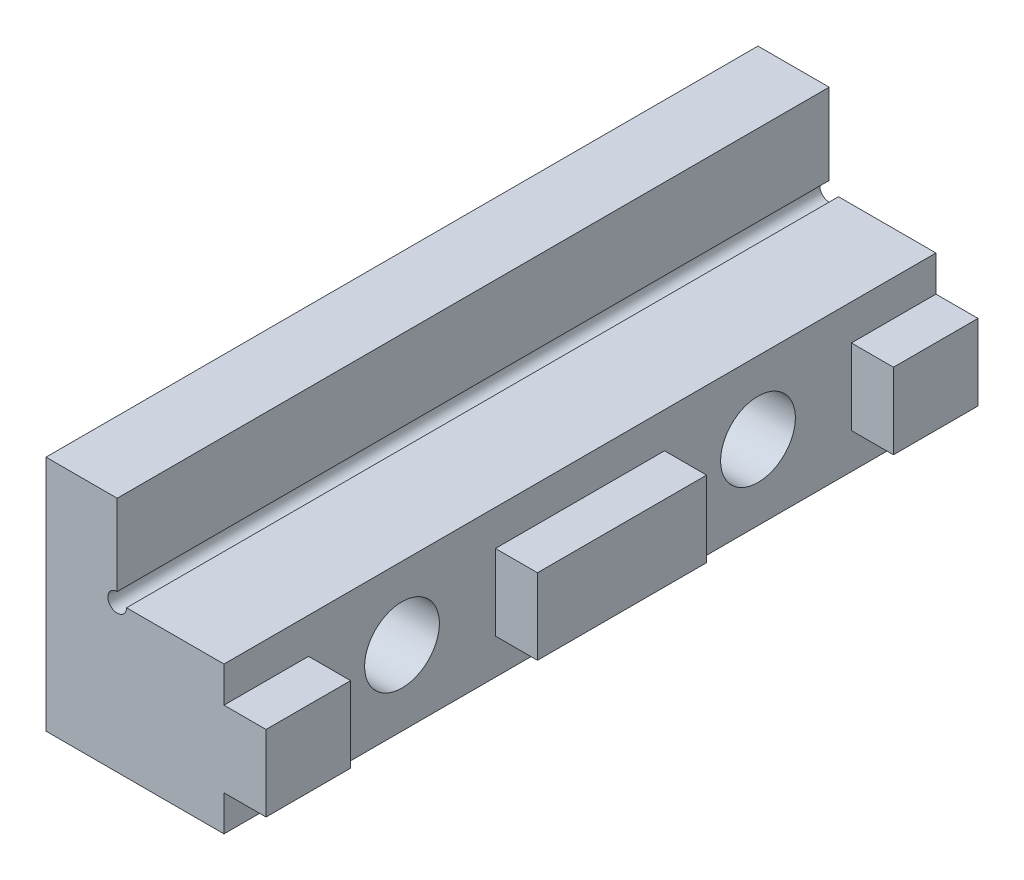
ISO-10303-21;
HEADER;
FILE_DESCRIPTION(('STEP AP214'),'2;1');
FILE_NAME('part.step','',(''),(''),'','','');
FILE_SCHEMA(('AUTOMOTIVE_DESIGN { 1 0 10303 214 1 1 1 1 }'));
ENDSEC;
DATA;
#1=APPLICATION_CONTEXT('core data for automotive mechanical design processes');
#2=APPLICATION_PROTOCOL_DEFINITION('international standard','automotive_design',2000,#1);
#3=PRODUCT_CONTEXT('',#1,'mechanical');
#4=PRODUCT('Part','Part','',(#3));
#5=PRODUCT_RELATED_PRODUCT_CATEGORY('part','',(#4));
#6=PRODUCT_DEFINITION_FORMATION('','',#4);
#7=PRODUCT_DEFINITION_CONTEXT('part definition',#1,'design');
#8=PRODUCT_DEFINITION('design','',#6,#7);
#9=PRODUCT_DEFINITION_SHAPE('','',#8);
#10=(LENGTH_UNIT() NAMED_UNIT(*) SI_UNIT(.MILLI.,.METRE.));
#11=(NAMED_UNIT(*) PLANE_ANGLE_UNIT() SI_UNIT($,.RADIAN.));
#12=(NAMED_UNIT(*) SI_UNIT($,.STERADIAN.) SOLID_ANGLE_UNIT());
#13=UNCERTAINTY_MEASURE_WITH_UNIT(LENGTH_MEASURE(1.E-05),#10,'distance_accuracy_value','');
#14=(GEOMETRIC_REPRESENTATION_CONTEXT(3) GLOBAL_UNCERTAINTY_ASSIGNED_CONTEXT((#13)) GLOBAL_UNIT_ASSIGNED_CONTEXT((#10,
#11,#12)) REPRESENTATION_CONTEXT('',''));
#15=CARTESIAN_POINT('',(0.,0.,0.));
#16=DIRECTION('',(0.,0.,1.));
#17=DIRECTION('',(1.,0.,0.));
#18=AXIS2_PLACEMENT_3D('',#15,#16,#17);
#19=CARTESIAN_POINT('',(0.,3.814,38.1));
#20=DIRECTION('',(0.,-1.,0.));
#21=DIRECTION('',(0.,0.,-1.));
#22=AXIS2_PLACEMENT_3D('',#19,#20,#21);
#23=PLANE('',#22);
#24=DIRECTION('',(-1.,0.,0.));
#25=VECTOR('',#24,1.);
#26=CARTESIAN_POINT('',(0.,3.814,29.05));
#27=LINE('',#26,#25);
#28=CARTESIAN_POINT('',(23.55,3.814,29.05));
#29=VERTEX_POINT('',#28);
#30=CARTESIAN_POINT('',(19.05,3.814,29.05));
#31=VERTEX_POINT('',#30);
#32=EDGE_CURVE('E345',#29,#31,#27,.T.);
#33=ORIENTED_EDGE('',*,*,#32,.F.);
#34=DIRECTION('',(0.,0.,-1.));
#35=VECTOR('',#34,1.);
#36=CARTESIAN_POINT('',(23.55,3.814,38.1));
#37=LINE('',#36,#35);
#38=CARTESIAN_POINT('',(23.55,3.814,38.1));
#39=VERTEX_POINT('',#38);
#40=EDGE_CURVE('E216',#39,#29,#37,.T.);
#41=ORIENTED_EDGE('',*,*,#40,.F.);
#42=DIRECTION('',(-1.,0.,0.));
#43=VECTOR('',#42,1.);
#44=CARTESIAN_POINT('',(0.,3.814,38.1));
#45=LINE('',#44,#43);
#46=CARTESIAN_POINT('',(19.05,3.814,38.1));
#47=VERTEX_POINT('',#46);
#48=EDGE_CURVE('E316',#39,#47,#45,.T.);
#49=ORIENTED_EDGE('',*,*,#48,.T.);
#50=DIRECTION('',(0.,0.,-1.));
#51=VECTOR('',#50,1.);
#52=CARTESIAN_POINT('',(19.05,3.814,38.1));
#53=LINE('',#52,#51);
#54=EDGE_CURVE('E228',#47,#31,#53,.T.);
#55=ORIENTED_EDGE('',*,*,#54,.T.);
#56=EDGE_LOOP('',(#33,#41,#49,#55));
#57=FACE_BOUND('',#56,.T.);
#58=ADVANCED_FACE('F37',(#57),#23,.T.);
#59=DIRECTION('',(1.,0.,0.));
#60=VECTOR('',#59,1.);
#61=CARTESIAN_POINT('',(0.,3.814,9.05));
#62=LINE('',#61,#60);
#63=CARTESIAN_POINT('',(19.05,3.814,9.05));
#64=VERTEX_POINT('',#63);
#65=CARTESIAN_POINT('',(23.55,3.814,9.05));
#66=VERTEX_POINT('',#65);
#67=EDGE_CURVE('E351',#64,#66,#62,.T.);
#68=ORIENTED_EDGE('',*,*,#67,.F.);
#69=CARTESIAN_POINT('',(19.05,3.814,-9.05));
#70=VERTEX_POINT('',#69);
#71=EDGE_CURVE('E227',#64,#70,#53,.T.);
#72=ORIENTED_EDGE('',*,*,#71,.T.);
#73=DIRECTION('',(-1.,0.,0.));
#74=VECTOR('',#73,1.);
#75=CARTESIAN_POINT('',(0.,3.814,-9.05));
#76=LINE('',#75,#74);
#77=CARTESIAN_POINT('',(23.55,3.814,-9.05));
#78=VERTEX_POINT('',#77);
#79=EDGE_CURVE('E357',#78,#70,#76,.T.);
#80=ORIENTED_EDGE('',*,*,#79,.F.);
#81=EDGE_CURVE('E215',#66,#78,#37,.T.);
#82=ORIENTED_EDGE('',*,*,#81,.F.);
#83=EDGE_LOOP('',(#68,#72,#80,#82));
#84=FACE_BOUND('',#83,.T.);
#85=ADVANCED_FACE('F376',(#84),#23,.T.);
#86=CARTESIAN_POINT('',(23.55,0.,38.1));
#87=DIRECTION('',(1.,0.,0.));
#88=DIRECTION('',(0.,0.,-1.));
#89=AXIS2_PLACEMENT_3D('',#86,#87,#88);
#90=PLANE('',#89);
#91=DIRECTION('',(0.,-1.,0.));
#92=VECTOR('',#91,1.);
#93=CARTESIAN_POINT('',(23.55,0.,29.05));
#94=LINE('',#93,#92);
#95=CARTESIAN_POINT('',(23.55,11.934,29.05));
#96=VERTEX_POINT('',#95);
#97=EDGE_CURVE('E346',#96,#29,#94,.T.);
#98=ORIENTED_EDGE('',*,*,#97,.F.);
#99=DIRECTION('',(0.,0.,-1.));
#100=VECTOR('',#99,1.);
#101=CARTESIAN_POINT('',(23.55,11.934,38.1));
#102=LINE('',#101,#100);
#103=CARTESIAN_POINT('',(23.55,11.934,38.1));
#104=VERTEX_POINT('',#103);
#105=EDGE_CURVE('E207',#104,#96,#102,.T.);
#106=ORIENTED_EDGE('',*,*,#105,.F.);
#107=DIRECTION('',(0.,-1.,0.));
#108=VECTOR('',#107,1.);
#109=CARTESIAN_POINT('',(23.55,0.,38.1));
#110=LINE('',#109,#108);
#111=EDGE_CURVE('E319',#104,#39,#110,.T.);
#112=ORIENTED_EDGE('',*,*,#111,.T.);
#113=ORIENTED_EDGE('',*,*,#40,.T.);
#114=EDGE_LOOP('',(#98,#106,#112,#113));
#115=FACE_BOUND('',#114,.T.);
#116=ADVANCED_FACE('F390',(#115),#90,.T.);
#117=DIRECTION('',(0.,1.,0.));
#118=VECTOR('',#117,1.);
#119=CARTESIAN_POINT('',(23.55,0.,9.05));
#120=LINE('',#119,#118);
#121=CARTESIAN_POINT('',(23.55,11.934,9.05));
#122=VERTEX_POINT('',#121);
#123=EDGE_CURVE('E353',#66,#122,#120,.T.);
#124=ORIENTED_EDGE('',*,*,#123,.F.);
#125=ORIENTED_EDGE('',*,*,#81,.T.);
#126=DIRECTION('',(0.,-1.,0.));
#127=VECTOR('',#126,1.);
#128=CARTESIAN_POINT('',(23.55,0.,-9.05));
#129=LINE('',#128,#127);
#130=CARTESIAN_POINT('',(23.55,11.934,-9.04999999999999));
#131=VERTEX_POINT('',#130);
#132=EDGE_CURVE('E181',#131,#78,#129,.T.);
#133=ORIENTED_EDGE('',*,*,#132,.F.);
#134=EDGE_CURVE('E206',#122,#131,#102,.T.);
#135=ORIENTED_EDGE('',*,*,#134,.F.);
#136=EDGE_LOOP('',(#124,#125,#133,#135));
#137=FACE_BOUND('',#136,.T.);
#138=ADVANCED_FACE('F388',(#137),#90,.T.);
#139=CARTESIAN_POINT('',(0.,11.934,38.1));
#140=DIRECTION('',(0.,1.,0.));
#141=DIRECTION('',(0.,0.,1.));
#142=AXIS2_PLACEMENT_3D('',#139,#140,#141);
#143=PLANE('',#142);
#144=DIRECTION('',(-1.,0.,0.));
#145=VECTOR('',#144,1.);
#146=CARTESIAN_POINT('',(0.,11.934,-29.05));
#147=LINE('',#146,#145);
#148=CARTESIAN_POINT('',(23.55,11.934,-29.05));
#149=VERTEX_POINT('',#148);
#150=CARTESIAN_POINT('',(19.05,11.934,-29.05));
#151=VERTEX_POINT('',#150);
#152=EDGE_CURVE('E171',#149,#151,#147,.T.);
#153=ORIENTED_EDGE('',*,*,#152,.F.);
#154=CARTESIAN_POINT('',(23.55,11.934,-38.1));
#155=VERTEX_POINT('',#154);
#156=EDGE_CURVE('E204',#149,#155,#102,.T.);
#157=ORIENTED_EDGE('',*,*,#156,.T.);
#158=DIRECTION('',(1.,0.,0.));
#159=VECTOR('',#158,1.);
#160=CARTESIAN_POINT('',(0.,11.934,-38.1));
#161=LINE('',#160,#159);
#162=CARTESIAN_POINT('',(19.05,11.934,-38.1));
#163=VERTEX_POINT('',#162);
#164=EDGE_CURVE('E196',#163,#155,#161,.T.);
#165=ORIENTED_EDGE('',*,*,#164,.F.);
#166=DIRECTION('',(0.,0.,-1.));
#167=VECTOR('',#166,1.);
#168=CARTESIAN_POINT('',(19.05,11.934,38.1));
#169=LINE('',#168,#167);
#170=EDGE_CURVE('E187',#151,#163,#169,.T.);
#171=ORIENTED_EDGE('',*,*,#170,.F.);
#172=EDGE_LOOP('',(#153,#157,#165,#171));
#173=FACE_BOUND('',#172,.T.);
#174=ADVANCED_FACE('F194',(#173),#143,.T.);
#175=DIRECTION('',(-1.,0.,0.));
#176=VECTOR('',#175,1.);
#177=CARTESIAN_POINT('',(0.,11.934,9.05));
#178=LINE('',#177,#176);
#179=CARTESIAN_POINT('',(19.05,11.934,9.05));
#180=VERTEX_POINT('',#179);
#181=EDGE_CURVE('E347',#122,#180,#178,.T.);
#182=ORIENTED_EDGE('',*,*,#181,.F.);
#183=ORIENTED_EDGE('',*,*,#134,.T.);
#184=DIRECTION('',(1.,0.,0.));
#185=VECTOR('',#184,1.);
#186=CARTESIAN_POINT('',(0.,11.934,-9.05));
#187=LINE('',#186,#185);
#188=CARTESIAN_POINT('',(19.05,11.934,-9.04999999999999));
#189=VERTEX_POINT('',#188);
#190=EDGE_CURVE('E355',#189,#131,#187,.T.);
#191=ORIENTED_EDGE('',*,*,#190,.F.);
#192=EDGE_CURVE('E197',#180,#189,#169,.T.);
#193=ORIENTED_EDGE('',*,*,#192,.F.);
#194=EDGE_LOOP('',(#182,#183,#191,#193));
#195=FACE_BOUND('',#194,.T.);
#196=ADVANCED_FACE('F385',(#195),#143,.T.);
#197=DIRECTION('',(1.,0.,0.));
#198=VECTOR('',#197,1.);
#199=CARTESIAN_POINT('',(0.,11.934,29.05));
#200=LINE('',#199,#198);
#201=CARTESIAN_POINT('',(19.05,11.934,29.05));
#202=VERTEX_POINT('',#201);
#203=EDGE_CURVE('E267',#202,#96,#200,.T.);
#204=ORIENTED_EDGE('',*,*,#203,.F.);
#205=CARTESIAN_POINT('',(19.05,11.934,38.1));
#206=VERTEX_POINT('',#205);
#207=EDGE_CURVE('E199',#206,#202,#169,.T.);
#208=ORIENTED_EDGE('',*,*,#207,.F.);
#209=DIRECTION('',(1.,0.,0.));
#210=VECTOR('',#209,1.);
#211=CARTESIAN_POINT('',(0.,11.934,38.1));
#212=LINE('',#211,#210);
#213=EDGE_CURVE('E321',#206,#104,#212,.T.);
#214=ORIENTED_EDGE('',*,*,#213,.T.);
#215=ORIENTED_EDGE('',*,*,#105,.T.);
#216=EDGE_LOOP('',(#204,#208,#214,#215));
#217=FACE_BOUND('',#216,.T.);
#218=ADVANCED_FACE('F343',(#217),#143,.T.);
#219=CARTESIAN_POINT('',(7.62,15.748,38.1));
#220=DIRECTION('',(0.,0.,-1.));
#221=DIRECTION('',(-1.,0.,0.));
#222=AXIS2_PLACEMENT_3D('',#219,#220,#221);
#223=CYLINDRICAL_SURFACE('',#222,1.);
#224=DIRECTION('',(0.,0.,-1.));
#225=VECTOR('',#224,1.);
#226=CARTESIAN_POINT('',(8.62,15.748,38.1));
#227=LINE('',#226,#225);
#228=CARTESIAN_POINT('',(8.62,15.748,38.1));
#229=VERTEX_POINT('',#228);
#230=CARTESIAN_POINT('',(8.62,15.748,-38.1));
#231=VERTEX_POINT('',#230);
#232=EDGE_CURVE('E54',#229,#231,#227,.T.);
#233=ORIENTED_EDGE('',*,*,#232,.T.);
#234=CARTESIAN_POINT('',(7.62,15.748,-38.1));
#235=DIRECTION('',(0.,0.,1.));
#236=DIRECTION('',(1.,0.,0.));
#237=AXIS2_PLACEMENT_3D('',#234,#235,#236);
#238=CIRCLE('',#237,1.);
#239=CARTESIAN_POINT('',(7.62,16.748,-38.1));
#240=VERTEX_POINT('',#239);
#241=EDGE_CURVE('E257',#240,#231,#238,.T.);
#242=ORIENTED_EDGE('',*,*,#241,.F.);
#243=DIRECTION('',(0.,0.,-1.));
#244=VECTOR('',#243,1.);
#245=CARTESIAN_POINT('',(7.62,16.748,38.1));
#246=LINE('',#245,#244);
#247=CARTESIAN_POINT('',(7.62,16.748,38.1));
#248=VERTEX_POINT('',#247);
#249=EDGE_CURVE('E248',#248,#240,#246,.T.);
#250=ORIENTED_EDGE('',*,*,#249,.F.);
#251=CARTESIAN_POINT('',(7.62,15.748,38.1));
#252=DIRECTION('',(0.,0.,1.));
#253=DIRECTION('',(1.,0.,0.));
#254=AXIS2_PLACEMENT_3D('',#251,#252,#253);
#255=CIRCLE('',#254,1.);
#256=EDGE_CURVE('E300',#248,#229,#255,.T.);
#257=ORIENTED_EDGE('',*,*,#256,.T.);
#258=EDGE_LOOP('',(#233,#242,#250,#257));
#259=FACE_BOUND('',#258,.T.);
#260=ADVANCED_FACE('F39',(#259),#223,.F.);
#261=CARTESIAN_POINT('',(7.62,0.,38.1));
#262=DIRECTION('',(1.,0.,0.));
#263=DIRECTION('',(0.,1.,0.));
#264=AXIS2_PLACEMENT_3D('',#261,#262,#263);
#265=PLANE('',#264);
#266=ORIENTED_EDGE('',*,*,#249,.T.);
#267=DIRECTION('',(0.,-1.,0.));
#268=VECTOR('',#267,1.);
#269=CARTESIAN_POINT('',(7.62,0.,-38.1));
#270=LINE('',#269,#268);
#271=CARTESIAN_POINT('',(7.62,25.4,-38.1));
#272=VERTEX_POINT('',#271);
#273=EDGE_CURVE('E277',#272,#240,#270,.T.);
#274=ORIENTED_EDGE('',*,*,#273,.F.);
#275=DIRECTION('',(0.,0.,-1.));
#276=VECTOR('',#275,1.);
#277=CARTESIAN_POINT('',(7.62,25.4,38.1));
#278=LINE('',#277,#276);
#279=CARTESIAN_POINT('',(7.62,25.4,38.1));
#280=VERTEX_POINT('',#279);
#281=EDGE_CURVE('E246',#280,#272,#278,.T.);
#282=ORIENTED_EDGE('',*,*,#281,.F.);
#283=DIRECTION('',(0.,-1.,0.));
#284=VECTOR('',#283,1.);
#285=CARTESIAN_POINT('',(7.62,0.,38.1));
#286=LINE('',#285,#284);
#287=EDGE_CURVE('E302',#280,#248,#286,.T.);
#288=ORIENTED_EDGE('',*,*,#287,.T.);
#289=EDGE_LOOP('',(#266,#274,#282,#288));
#290=FACE_BOUND('',#289,.T.);
#291=ADVANCED_FACE('F335',(#290),#265,.T.);
#292=CARTESIAN_POINT('',(0.,25.4,38.1));
#293=DIRECTION('',(0.,1.,0.));
#294=DIRECTION('',(0.,0.,1.));
#295=AXIS2_PLACEMENT_3D('',#292,#293,#294);
#296=PLANE('',#295);
#297=ORIENTED_EDGE('',*,*,#281,.T.);
#298=DIRECTION('',(1.,0.,0.));
#299=VECTOR('',#298,1.);
#300=CARTESIAN_POINT('',(0.,25.4,-38.1));
#301=LINE('',#300,#299);
#302=CARTESIAN_POINT('',(0.,25.4,-38.1));
#303=VERTEX_POINT('',#302);
#304=EDGE_CURVE('E280',#303,#272,#301,.T.);
#305=ORIENTED_EDGE('',*,*,#304,.F.);
#306=DIRECTION('',(0.,0.,-1.));
#307=VECTOR('',#306,1.);
#308=CARTESIAN_POINT('',(0.,25.4,38.1));
#309=LINE('',#308,#307);
#310=CARTESIAN_POINT('',(0.,25.4,38.1));
#311=VERTEX_POINT('',#310);
#312=EDGE_CURVE('E242',#311,#303,#309,.T.);
#313=ORIENTED_EDGE('',*,*,#312,.F.);
#314=DIRECTION('',(1.,0.,0.));
#315=VECTOR('',#314,1.);
#316=CARTESIAN_POINT('',(0.,25.4,38.1));
#317=LINE('',#316,#315);
#318=EDGE_CURVE('E305',#311,#280,#317,.T.);
#319=ORIENTED_EDGE('',*,*,#318,.T.);
#320=EDGE_LOOP('',(#297,#305,#313,#319));
#321=FACE_BOUND('',#320,.T.);
#322=ADVANCED_FACE('F420',(#321),#296,.T.);
#323=CARTESIAN_POINT('',(0.,0.,38.1));
#324=DIRECTION('',(-1.,0.,0.));
#325=DIRECTION('',(0.,0.,1.));
#326=AXIS2_PLACEMENT_3D('',#323,#324,#325);
#327=PLANE('',#326);
#328=CARTESIAN_POINT('',(0.,8.,19.05));
#329=DIRECTION('',(1.,0.,0.));
#330=DIRECTION('',(0.,0.,-1.));
#331=AXIS2_PLACEMENT_3D('',#328,#329,#330);
#332=CIRCLE('',#331,6.5);
#333=CARTESIAN_POINT('',(0.,8.,12.55));
#334=VERTEX_POINT('',#333);
#335=EDGE_CURVE('E259',#334,#334,#332,.T.);
#336=ORIENTED_EDGE('',*,*,#335,.T.);
#337=EDGE_LOOP('',(#336));
#338=FACE_BOUND('',#337,.T.);
#339=CARTESIAN_POINT('',(0.,8.,-19.05));
#340=DIRECTION('',(1.,0.,0.));
#341=DIRECTION('',(0.,0.,-1.));
#342=AXIS2_PLACEMENT_3D('',#339,#340,#341);
#343=CIRCLE('',#342,6.5);
#344=CARTESIAN_POINT('',(0.,8.,-25.55));
#345=VERTEX_POINT('',#344);
#346=EDGE_CURVE('E272',#345,#345,#343,.T.);
#347=ORIENTED_EDGE('',*,*,#346,.T.);
#348=EDGE_LOOP('',(#347));
#349=FACE_BOUND('',#348,.T.);
#350=ORIENTED_EDGE('',*,*,#312,.T.);
#351=DIRECTION('',(0.,1.,0.));
#352=VECTOR('',#351,1.);
#353=CARTESIAN_POINT('',(0.,0.,-38.1));
#354=LINE('',#353,#352);
#355=CARTESIAN_POINT('',(0.,0.,-38.1));
#356=VERTEX_POINT('',#355);
#357=EDGE_CURVE('E283',#356,#303,#354,.T.);
#358=ORIENTED_EDGE('',*,*,#357,.F.);
#359=DIRECTION('',(0.,0.,-1.));
#360=VECTOR('',#359,1.);
#361=CARTESIAN_POINT('',(0.,0.,38.1));
#362=LINE('',#361,#360);
#363=CARTESIAN_POINT('',(0.,0.,38.1));
#364=VERTEX_POINT('',#363);
#365=EDGE_CURVE('E239',#364,#356,#362,.T.);
#366=ORIENTED_EDGE('',*,*,#365,.F.);
#367=DIRECTION('',(0.,1.,0.));
#368=VECTOR('',#367,1.);
#369=CARTESIAN_POINT('',(0.,0.,38.1));
#370=LINE('',#369,#368);
#371=EDGE_CURVE('E308',#364,#311,#370,.T.);
#372=ORIENTED_EDGE('',*,*,#371,.T.);
#373=EDGE_LOOP('',(#350,#358,#366,#372));
#374=FACE_BOUND('',#373,.T.);
#375=ADVANCED_FACE('F411',(#338,#349,#374),#327,.T.);
#376=CARTESIAN_POINT('',(0.,0.,38.1));
#377=DIRECTION('',(0.,-1.,0.));
#378=DIRECTION('',(0.,0.,-1.));
#379=AXIS2_PLACEMENT_3D('',#376,#377,#378);
#380=PLANE('',#379);
#381=ORIENTED_EDGE('',*,*,#365,.T.);
#382=DIRECTION('',(-1.,0.,0.));
#383=VECTOR('',#382,1.);
#384=CARTESIAN_POINT('',(0.,0.,-38.1));
#385=LINE('',#384,#383);
#386=CARTESIAN_POINT('',(19.05,0.,-38.1));
#387=VERTEX_POINT('',#386);
#388=EDGE_CURVE('E286',#387,#356,#385,.T.);
#389=ORIENTED_EDGE('',*,*,#388,.F.);
#390=DIRECTION('',(0.,0.,-1.));
#391=VECTOR('',#390,1.);
#392=CARTESIAN_POINT('',(19.05,0.,38.1));
#393=LINE('',#392,#391);
#394=CARTESIAN_POINT('',(19.05,0.,38.1));
#395=VERTEX_POINT('',#394);
#396=EDGE_CURVE('E235',#395,#387,#393,.T.);
#397=ORIENTED_EDGE('',*,*,#396,.F.);
#398=DIRECTION('',(-1.,0.,0.));
#399=VECTOR('',#398,1.);
#400=CARTESIAN_POINT('',(0.,0.,38.1));
#401=LINE('',#400,#399);
#402=EDGE_CURVE('E311',#395,#364,#401,.T.);
#403=ORIENTED_EDGE('',*,*,#402,.T.);
#404=EDGE_LOOP('',(#381,#389,#397,#403));
#405=FACE_BOUND('',#404,.T.);
#406=ADVANCED_FACE('F407',(#405),#380,.T.);
#407=DIRECTION('',(1.,0.,0.));
#408=VECTOR('',#407,1.);
#409=CARTESIAN_POINT('',(0.,3.814,-29.05));
#410=LINE('',#409,#408);
#411=CARTESIAN_POINT('',(19.05,3.814,-29.05));
#412=VERTEX_POINT('',#411);
#413=CARTESIAN_POINT('',(23.55,3.814,-29.05));
#414=VERTEX_POINT('',#413);
#415=EDGE_CURVE('E182',#412,#414,#410,.T.);
#416=ORIENTED_EDGE('',*,*,#415,.F.);
#417=CARTESIAN_POINT('',(19.05,3.814,-38.1));
#418=VERTEX_POINT('',#417);
#419=EDGE_CURVE('E190',#412,#418,#53,.T.);
#420=ORIENTED_EDGE('',*,*,#419,.T.);
#421=DIRECTION('',(-1.,0.,0.));
#422=VECTOR('',#421,1.);
#423=CARTESIAN_POINT('',(0.,3.814,-38.1));
#424=LINE('',#423,#422);
#425=CARTESIAN_POINT('',(23.55,3.814,-38.1));
#426=VERTEX_POINT('',#425);
#427=EDGE_CURVE('E291',#426,#418,#424,.T.);
#428=ORIENTED_EDGE('',*,*,#427,.F.);
#429=EDGE_CURVE('E211',#414,#426,#37,.T.);
#430=ORIENTED_EDGE('',*,*,#429,.F.);
#431=EDGE_LOOP('',(#416,#420,#428,#430));
#432=FACE_BOUND('',#431,.T.);
#433=ADVANCED_FACE('F400',(#432),#23,.T.);
#434=DIRECTION('',(0.,1.,0.));
#435=VECTOR('',#434,1.);
#436=CARTESIAN_POINT('',(23.55,0.,-29.05));
#437=LINE('',#436,#435);
#438=EDGE_CURVE('E177',#414,#149,#437,.T.);
#439=ORIENTED_EDGE('',*,*,#438,.F.);
#440=ORIENTED_EDGE('',*,*,#429,.T.);
#441=DIRECTION('',(0.,-1.,0.));
#442=VECTOR('',#441,1.);
#443=CARTESIAN_POINT('',(23.55,0.,-38.1));
#444=LINE('',#443,#442);
#445=EDGE_CURVE('E294',#155,#426,#444,.T.);
#446=ORIENTED_EDGE('',*,*,#445,.F.);
#447=ORIENTED_EDGE('',*,*,#156,.F.);
#448=EDGE_LOOP('',(#439,#440,#446,#447));
#449=FACE_BOUND('',#448,.T.);
#450=ADVANCED_FACE('F392',(#449),#90,.T.);
#451=CARTESIAN_POINT('',(19.05,0.,38.1));
#452=DIRECTION('',(1.,0.,0.));
#453=DIRECTION('',(0.,0.,-1.));
#454=AXIS2_PLACEMENT_3D('',#451,#452,#453);
#455=PLANE('',#454);
#456=DIRECTION('',(0.,-1.,0.));
#457=VECTOR('',#456,1.);
#458=CARTESIAN_POINT('',(19.05,0.,-29.05));
#459=LINE('',#458,#457);
#460=EDGE_CURVE('E174',#151,#412,#459,.T.);
#461=ORIENTED_EDGE('',*,*,#460,.F.);
#462=ORIENTED_EDGE('',*,*,#170,.T.);
#463=DIRECTION('',(0.,-1.,0.));
#464=VECTOR('',#463,1.);
#465=CARTESIAN_POINT('',(19.05,0.,-38.1));
#466=LINE('',#465,#464);
#467=CARTESIAN_POINT('',(19.05,15.748,-38.1));
#468=VERTEX_POINT('',#467);
#469=EDGE_CURVE('E292',#468,#163,#466,.T.);
#470=ORIENTED_EDGE('',*,*,#469,.F.);
#471=DIRECTION('',(0.,0.,-1.));
#472=VECTOR('',#471,1.);
#473=CARTESIAN_POINT('',(19.05,15.748,38.1));
#474=LINE('',#473,#472);
#475=CARTESIAN_POINT('',(19.05,15.748,38.1));
#476=VERTEX_POINT('',#475);
#477=EDGE_CURVE('E62',#476,#468,#474,.T.);
#478=ORIENTED_EDGE('',*,*,#477,.F.);
#479=DIRECTION('',(0.,-1.,0.));
#480=VECTOR('',#479,1.);
#481=CARTESIAN_POINT('',(19.05,0.,38.1));
#482=LINE('',#481,#480);
#483=EDGE_CURVE('E317',#476,#206,#482,.T.);
#484=ORIENTED_EDGE('',*,*,#483,.T.);
#485=ORIENTED_EDGE('',*,*,#207,.T.);
#486=DIRECTION('',(0.,1.,0.));
#487=VECTOR('',#486,1.);
#488=CARTESIAN_POINT('',(19.05,0.,29.05));
#489=LINE('',#488,#487);
#490=EDGE_CURVE('E362',#31,#202,#489,.T.);
#491=ORIENTED_EDGE('',*,*,#490,.F.);
#492=ORIENTED_EDGE('',*,*,#54,.F.);
#493=EDGE_CURVE('E314',#47,#395,#482,.T.);
#494=ORIENTED_EDGE('',*,*,#493,.T.);
#495=ORIENTED_EDGE('',*,*,#396,.T.);
#496=EDGE_CURVE('E289',#418,#387,#466,.T.);
#497=ORIENTED_EDGE('',*,*,#496,.F.);
#498=ORIENTED_EDGE('',*,*,#419,.F.);
#499=EDGE_LOOP('',(#461,#462,#470,#478,#484,#485,#491,#492,#494,#495,#497,#498));
#500=FACE_BOUND('',#499,.T.);
#501=DIRECTION('',(0.,-1.,0.));
#502=VECTOR('',#501,1.);
#503=CARTESIAN_POINT('',(19.05,0.,9.05));
#504=LINE('',#503,#502);
#505=EDGE_CURVE('E363',#180,#64,#504,.T.);
#506=ORIENTED_EDGE('',*,*,#505,.F.);
#507=ORIENTED_EDGE('',*,*,#192,.T.);
#508=DIRECTION('',(0.,1.,0.));
#509=VECTOR('',#508,1.);
#510=CARTESIAN_POINT('',(19.05,0.,-9.05));
#511=LINE('',#510,#509);
#512=EDGE_CURVE('E191',#70,#189,#511,.T.);
#513=ORIENTED_EDGE('',*,*,#512,.F.);
#514=ORIENTED_EDGE('',*,*,#71,.F.);
#515=EDGE_LOOP('',(#506,#507,#513,#514));
#516=FACE_BOUND('',#515,.T.);
#517=CARTESIAN_POINT('',(19.05,8.,19.05));
#518=DIRECTION('',(1.,0.,0.));
#519=DIRECTION('',(0.,0.,-1.));
#520=AXIS2_PLACEMENT_3D('',#517,#518,#519);
#521=CIRCLE('',#520,4.);
#522=CARTESIAN_POINT('',(19.05,8.,23.05));
#523=VERTEX_POINT('',#522);
#524=EDGE_CURVE('E46',#523,#523,#521,.F.);
#525=ORIENTED_EDGE('',*,*,#524,.T.);
#526=EDGE_LOOP('',(#525));
#527=FACE_BOUND('',#526,.T.);
#528=CARTESIAN_POINT('',(19.05,8.,-19.05));
#529=DIRECTION('',(1.,0.,0.));
#530=DIRECTION('',(0.,0.,-1.));
#531=AXIS2_PLACEMENT_3D('',#528,#529,#530);
#532=CIRCLE('',#531,4.);
#533=CARTESIAN_POINT('',(19.05,8.,-15.05));
#534=VERTEX_POINT('',#533);
#535=EDGE_CURVE('E11',#534,#534,#532,.F.);
#536=ORIENTED_EDGE('',*,*,#535,.T.);
#537=EDGE_LOOP('',(#536));
#538=FACE_BOUND('',#537,.T.);
#539=ADVANCED_FACE('F185',(#500,#516,#527,#538),#455,.T.);
#540=CARTESIAN_POINT('',(0.,15.748,38.1));
#541=DIRECTION('',(0.,1.,0.));
#542=DIRECTION('',(0.,0.,1.));
#543=AXIS2_PLACEMENT_3D('',#540,#541,#542);
#544=PLANE('',#543);
#545=ORIENTED_EDGE('',*,*,#477,.T.);
#546=DIRECTION('',(1.,0.,0.));
#547=VECTOR('',#546,1.);
#548=CARTESIAN_POINT('',(0.,15.748,-38.1));
#549=LINE('',#548,#547);
#550=EDGE_CURVE('E297',#231,#468,#549,.T.);
#551=ORIENTED_EDGE('',*,*,#550,.F.);
#552=ORIENTED_EDGE('',*,*,#232,.F.);
#553=DIRECTION('',(1.,0.,0.));
#554=VECTOR('',#553,1.);
#555=CARTESIAN_POINT('',(0.,15.748,38.1));
#556=LINE('',#555,#554);
#557=EDGE_CURVE('E323',#229,#476,#556,.T.);
#558=ORIENTED_EDGE('',*,*,#557,.T.);
#559=EDGE_LOOP('',(#545,#551,#552,#558));
#560=FACE_BOUND('',#559,.T.);
#561=ADVANCED_FACE('F329',(#560),#544,.T.);
#562=CARTESIAN_POINT('',(0.,0.,38.1));
#563=DIRECTION('',(0.,0.,1.));
#564=DIRECTION('',(1.,0.,0.));
#565=AXIS2_PLACEMENT_3D('',#562,#563,#564);
#566=PLANE('',#565);
#567=ORIENTED_EDGE('',*,*,#256,.F.);
#568=ORIENTED_EDGE('',*,*,#287,.F.);
#569=ORIENTED_EDGE('',*,*,#318,.F.);
#570=ORIENTED_EDGE('',*,*,#371,.F.);
#571=ORIENTED_EDGE('',*,*,#402,.F.);
#572=ORIENTED_EDGE('',*,*,#493,.F.);
#573=ORIENTED_EDGE('',*,*,#48,.F.);
#574=ORIENTED_EDGE('',*,*,#111,.F.);
#575=ORIENTED_EDGE('',*,*,#213,.F.);
#576=ORIENTED_EDGE('',*,*,#483,.F.);
#577=ORIENTED_EDGE('',*,*,#557,.F.);
#578=EDGE_LOOP('',(#567,#568,#569,#570,#571,#572,#573,#574,#575,#576,#577));
#579=FACE_BOUND('',#578,.T.);
#580=ADVANCED_FACE('F338',(#579),#566,.T.);
#581=CARTESIAN_POINT('',(0.,0.,-38.1));
#582=DIRECTION('',(0.,0.,1.));
#583=DIRECTION('',(1.,0.,0.));
#584=AXIS2_PLACEMENT_3D('',#581,#582,#583);
#585=PLANE('',#584);
#586=ORIENTED_EDGE('',*,*,#241,.T.);
#587=ORIENTED_EDGE('',*,*,#550,.T.);
#588=ORIENTED_EDGE('',*,*,#469,.T.);
#589=ORIENTED_EDGE('',*,*,#164,.T.);
#590=ORIENTED_EDGE('',*,*,#445,.T.);
#591=ORIENTED_EDGE('',*,*,#427,.T.);
#592=ORIENTED_EDGE('',*,*,#496,.T.);
#593=ORIENTED_EDGE('',*,*,#388,.T.);
#594=ORIENTED_EDGE('',*,*,#357,.T.);
#595=ORIENTED_EDGE('',*,*,#304,.T.);
#596=ORIENTED_EDGE('',*,*,#273,.T.);
#597=EDGE_LOOP('',(#586,#587,#588,#589,#590,#591,#592,#593,#594,#595,#596));
#598=FACE_BOUND('',#597,.T.);
#599=ADVANCED_FACE('F331',(#598),#585,.F.);
#600=CARTESIAN_POINT('',(55.4,8.,19.05));
#601=DIRECTION('',(-1.,0.,0.));
#602=DIRECTION('',(0.,0.,1.));
#603=AXIS2_PLACEMENT_3D('',#600,#601,#602);
#604=CYLINDRICAL_SURFACE('',#603,4.);
#605=CARTESIAN_POINT('',(8.2,8.,19.05));
#606=DIRECTION('',(1.,0.,0.));
#607=DIRECTION('',(0.,0.,-1.));
#608=AXIS2_PLACEMENT_3D('',#605,#606,#607);
#609=CIRCLE('',#608,4.);
#610=CARTESIAN_POINT('',(8.19999999999999,8.,23.05));
#611=VERTEX_POINT('',#610);
#612=EDGE_CURVE('E41',#611,#611,#609,.T.);
#613=CARTESIAN_POINT('',(19.05,8.,23.05));
#614=CARTESIAN_POINT('',(18.9369791666667,8.,23.05));
#615=CARTESIAN_POINT('',(18.8239583333333,8.,23.05));
#616=CARTESIAN_POINT('',(18.5979166666667,8.,23.05));
#617=CARTESIAN_POINT('',(18.4848958333333,8.,23.05));
#618=CARTESIAN_POINT('',(18.2588541666667,8.,23.05));
#619=CARTESIAN_POINT('',(18.1458333333333,8.,23.05));
#620=CARTESIAN_POINT('',(17.9197916666667,8.,23.05));
#621=CARTESIAN_POINT('',(17.8067708333333,8.,23.05));
#622=CARTESIAN_POINT('',(17.5807291666667,8.,23.05));
#623=CARTESIAN_POINT('',(17.4677083333333,8.,23.05));
#624=CARTESIAN_POINT('',(17.2416666666667,8.,23.05));
#625=CARTESIAN_POINT('',(17.1286458333333,8.,23.05));
#626=CARTESIAN_POINT('',(16.9026041666667,8.,23.05));
#627=CARTESIAN_POINT('',(16.7895833333333,8.,23.05));
#628=CARTESIAN_POINT('',(16.5635416666667,8.,23.05));
#629=CARTESIAN_POINT('',(16.4505208333333,8.,23.05));
#630=CARTESIAN_POINT('',(16.2244791666667,8.,23.05));
#631=CARTESIAN_POINT('',(16.1114583333333,8.,23.05));
#632=CARTESIAN_POINT('',(15.8854166666667,8.,23.05));
#633=CARTESIAN_POINT('',(15.7723958333333,8.,23.05));
#634=CARTESIAN_POINT('',(15.5463541666667,8.,23.05));
#635=CARTESIAN_POINT('',(15.4333333333333,8.,23.05));
#636=CARTESIAN_POINT('',(15.2072916666667,8.,23.05));
#637=CARTESIAN_POINT('',(15.0942708333333,8.,23.05));
#638=CARTESIAN_POINT('',(14.8682291666667,8.,23.05));
#639=CARTESIAN_POINT('',(14.7552083333333,8.,23.05));
#640=CARTESIAN_POINT('',(14.5291666666667,8.,23.05));
#641=CARTESIAN_POINT('',(14.4161458333333,8.,23.05));
#642=CARTESIAN_POINT('',(14.1901041666667,8.,23.05));
#643=CARTESIAN_POINT('',(14.0770833333333,8.,23.05));
#644=CARTESIAN_POINT('',(13.8510416666667,8.,23.05));
#645=CARTESIAN_POINT('',(13.7380208333333,8.,23.05));
#646=CARTESIAN_POINT('',(13.5119791666667,8.,23.05));
#647=CARTESIAN_POINT('',(13.3989583333333,8.,23.05));
#648=CARTESIAN_POINT('',(13.1729166666667,8.,23.05));
#649=CARTESIAN_POINT('',(13.0598958333333,8.,23.05));
#650=CARTESIAN_POINT('',(12.8338541666667,8.,23.05));
#651=CARTESIAN_POINT('',(12.7208333333333,8.,23.05));
#652=CARTESIAN_POINT('',(12.4947916666667,8.,23.05));
#653=CARTESIAN_POINT('',(12.3817708333333,8.,23.05));
#654=CARTESIAN_POINT('',(12.1557291666667,8.,23.05));
#655=CARTESIAN_POINT('',(12.0427083333333,8.,23.05));
#656=CARTESIAN_POINT('',(11.8166666666667,8.,23.05));
#657=CARTESIAN_POINT('',(11.7036458333333,8.,23.05));
#658=CARTESIAN_POINT('',(11.4776041666667,8.,23.05));
#659=CARTESIAN_POINT('',(11.3645833333333,8.,23.05));
#660=CARTESIAN_POINT('',(11.1385416666667,8.,23.05));
#661=CARTESIAN_POINT('',(11.0255208333333,8.,23.05));
#662=CARTESIAN_POINT('',(10.7994791666667,8.,23.05));
#663=CARTESIAN_POINT('',(10.6864583333333,8.,23.05));
#664=CARTESIAN_POINT('',(10.4604166666667,8.,23.05));
#665=CARTESIAN_POINT('',(10.3473958333333,8.,23.05));
#666=CARTESIAN_POINT('',(10.1213541666667,8.,23.05));
#667=CARTESIAN_POINT('',(10.0083333333333,8.,23.05));
#668=CARTESIAN_POINT('',(9.78229166666666,8.,23.05));
#669=CARTESIAN_POINT('',(9.66927083333333,8.,23.05));
#670=CARTESIAN_POINT('',(9.44322916666666,8.,23.05));
#671=CARTESIAN_POINT('',(9.33020833333333,8.,23.05));
#672=CARTESIAN_POINT('',(9.10416666666666,8.,23.05));
#673=CARTESIAN_POINT('',(8.99114583333333,8.,23.05));
#674=CARTESIAN_POINT('',(8.76510416666666,8.,23.05));
#675=CARTESIAN_POINT('',(8.65208333333333,8.,23.05));
#676=CARTESIAN_POINT('',(8.42604166666666,8.,23.05));
#677=CARTESIAN_POINT('',(8.31302083333333,8.,23.05));
#678=CARTESIAN_POINT('',(8.19999999999999,8.,23.05));
#679=B_SPLINE_CURVE_WITH_KNOTS('',3,(#613,#614,#615,#616,#617,#618,#619,#620,#621,#622,#623,
#624,#625,#626,#627,#628,#629,#630,#631,#632,#633,#634,#635,#636,#637,#638,#639,#640,#641,#642,
#643,#644,#645,#646,#647,#648,#649,#650,#651,#652,#653,#654,#655,#656,#657,#658,#659,#660,#661,
#662,#663,#664,#665,#666,#667,#668,#669,#670,#671,#672,#673,#674,#675,#676,#677,#678),
.UNSPECIFIED.,.F.,.F.,(4,2,2,2,2,2,2,2,2,2,2,2,2,2,2,2,2,2,2,2,2,2,2,2,2,2,2,2,2,2,2,2,4),(0.,
0.339062500000001,0.678125000000002,1.0171875,1.35625,1.6953125,2.03437500000001,
2.37343750000001,2.71250000000001,3.0515625,3.390625,3.7296875,4.06875,4.4078125,4.746875,
5.08593750000001,5.42500000000001,5.76406250000001,6.10312500000001,6.44218750000001,
6.78125000000001,7.12031250000001,7.45937500000001,7.7984375,8.13750000000001,8.47656250000001,
8.81562500000001,9.15468750000001,9.49375000000001,9.83281250000001,10.171875,10.5109375,10.85),.UNSPECIFIED.);
#680=EDGE_CURVE('BSEAM447',#523,#611,#679,.T.);
#681=ORIENTED_EDGE('',*,*,#524,.F.);
#682=ORIENTED_EDGE('',*,*,#612,.F.);
#683=ORIENTED_EDGE('',*,*,#680,.T.);
#684=ORIENTED_EDGE('',*,*,#680,.F.);
#685=EDGE_LOOP('',(#681,#683,#682,#684));
#686=FACE_BOUND('',#685,.T.);
#687=ADVANCED_FACE('F447',(#686),#604,.F.);
#688=CARTESIAN_POINT('',(55.4,8.,-19.05));
#689=DIRECTION('',(-1.,0.,0.));
#690=DIRECTION('',(0.,0.,1.));
#691=AXIS2_PLACEMENT_3D('',#688,#689,#690);
#692=CYLINDRICAL_SURFACE('',#691,4.);
#693=CARTESIAN_POINT('',(8.2,8.,-19.05));
#694=DIRECTION('',(1.,0.,0.));
#695=DIRECTION('',(0.,0.,-1.));
#696=AXIS2_PLACEMENT_3D('',#693,#694,#695);
#697=CIRCLE('',#696,4.);
#698=CARTESIAN_POINT('',(8.19999999999999,8.,-15.05));
#699=VERTEX_POINT('',#698);
#700=EDGE_CURVE('E251',#699,#699,#697,.T.);
#701=CARTESIAN_POINT('',(19.05,8.,-15.05));
#702=CARTESIAN_POINT('',(18.9369791666667,8.,-15.05));
#703=CARTESIAN_POINT('',(18.8239583333333,8.,-15.05));
#704=CARTESIAN_POINT('',(18.5979166666667,8.,-15.05));
#705=CARTESIAN_POINT('',(18.4848958333333,8.,-15.05));
#706=CARTESIAN_POINT('',(18.2588541666667,8.,-15.05));
#707=CARTESIAN_POINT('',(18.1458333333333,8.,-15.05));
#708=CARTESIAN_POINT('',(17.9197916666667,8.,-15.05));
#709=CARTESIAN_POINT('',(17.8067708333333,8.,-15.05));
#710=CARTESIAN_POINT('',(17.5807291666667,8.,-15.05));
#711=CARTESIAN_POINT('',(17.4677083333333,8.,-15.05));
#712=CARTESIAN_POINT('',(17.2416666666667,8.,-15.05));
#713=CARTESIAN_POINT('',(17.1286458333333,8.,-15.05));
#714=CARTESIAN_POINT('',(16.9026041666667,8.,-15.05));
#715=CARTESIAN_POINT('',(16.7895833333333,8.,-15.05));
#716=CARTESIAN_POINT('',(16.5635416666667,8.,-15.05));
#717=CARTESIAN_POINT('',(16.4505208333333,8.,-15.05));
#718=CARTESIAN_POINT('',(16.2244791666667,8.,-15.05));
#719=CARTESIAN_POINT('',(16.1114583333333,8.,-15.05));
#720=CARTESIAN_POINT('',(15.8854166666667,8.,-15.05));
#721=CARTESIAN_POINT('',(15.7723958333333,8.,-15.05));
#722=CARTESIAN_POINT('',(15.5463541666667,8.,-15.05));
#723=CARTESIAN_POINT('',(15.4333333333333,8.,-15.05));
#724=CARTESIAN_POINT('',(15.2072916666667,8.,-15.05));
#725=CARTESIAN_POINT('',(15.0942708333333,8.,-15.05));
#726=CARTESIAN_POINT('',(14.8682291666667,8.,-15.05));
#727=CARTESIAN_POINT('',(14.7552083333333,8.,-15.05));
#728=CARTESIAN_POINT('',(14.5291666666667,8.,-15.05));
#729=CARTESIAN_POINT('',(14.4161458333333,8.,-15.05));
#730=CARTESIAN_POINT('',(14.1901041666667,8.,-15.05));
#731=CARTESIAN_POINT('',(14.0770833333333,8.,-15.05));
#732=CARTESIAN_POINT('',(13.8510416666667,8.,-15.05));
#733=CARTESIAN_POINT('',(13.7380208333333,8.,-15.05));
#734=CARTESIAN_POINT('',(13.5119791666667,8.,-15.05));
#735=CARTESIAN_POINT('',(13.3989583333333,8.,-15.05));
#736=CARTESIAN_POINT('',(13.1729166666667,8.,-15.05));
#737=CARTESIAN_POINT('',(13.0598958333333,8.,-15.05));
#738=CARTESIAN_POINT('',(12.8338541666667,8.,-15.05));
#739=CARTESIAN_POINT('',(12.7208333333333,8.,-15.05));
#740=CARTESIAN_POINT('',(12.4947916666667,8.,-15.05));
#741=CARTESIAN_POINT('',(12.3817708333333,8.,-15.05));
#742=CARTESIAN_POINT('',(12.1557291666667,8.,-15.05));
#743=CARTESIAN_POINT('',(12.0427083333333,8.,-15.05));
#744=CARTESIAN_POINT('',(11.8166666666667,8.,-15.05));
#745=CARTESIAN_POINT('',(11.7036458333333,8.,-15.05));
#746=CARTESIAN_POINT('',(11.4776041666667,8.,-15.05));
#747=CARTESIAN_POINT('',(11.3645833333333,8.,-15.05));
#748=CARTESIAN_POINT('',(11.1385416666667,8.,-15.05));
#749=CARTESIAN_POINT('',(11.0255208333333,8.,-15.05));
#750=CARTESIAN_POINT('',(10.7994791666667,8.,-15.05));
#751=CARTESIAN_POINT('',(10.6864583333333,8.,-15.05));
#752=CARTESIAN_POINT('',(10.4604166666667,8.,-15.05));
#753=CARTESIAN_POINT('',(10.3473958333333,8.,-15.05));
#754=CARTESIAN_POINT('',(10.1213541666667,8.,-15.05));
#755=CARTESIAN_POINT('',(10.0083333333333,8.,-15.05));
#756=CARTESIAN_POINT('',(9.78229166666666,8.,-15.05));
#757=CARTESIAN_POINT('',(9.66927083333333,8.,-15.05));
#758=CARTESIAN_POINT('',(9.44322916666666,8.,-15.05));
#759=CARTESIAN_POINT('',(9.33020833333333,8.,-15.05));
#760=CARTESIAN_POINT('',(9.10416666666666,8.,-15.05));
#761=CARTESIAN_POINT('',(8.99114583333333,8.,-15.05));
#762=CARTESIAN_POINT('',(8.76510416666666,8.,-15.05));
#763=CARTESIAN_POINT('',(8.65208333333333,8.,-15.05));
#764=CARTESIAN_POINT('',(8.42604166666666,8.,-15.05));
#765=CARTESIAN_POINT('',(8.31302083333333,8.,-15.05));
#766=CARTESIAN_POINT('',(8.19999999999999,8.,-15.05));
#767=B_SPLINE_CURVE_WITH_KNOTS('',3,(#701,#702,#703,#704,#705,#706,#707,#708,#709,#710,#711,
#712,#713,#714,#715,#716,#717,#718,#719,#720,#721,#722,#723,#724,#725,#726,#727,#728,#729,#730,
#731,#732,#733,#734,#735,#736,#737,#738,#739,#740,#741,#742,#743,#744,#745,#746,#747,#748,#749,
#750,#751,#752,#753,#754,#755,#756,#757,#758,#759,#760,#761,#762,#763,#764,#765,#766),
.UNSPECIFIED.,.F.,.F.,(4,2,2,2,2,2,2,2,2,2,2,2,2,2,2,2,2,2,2,2,2,2,2,2,2,2,2,2,2,2,2,2,4),(0.,
0.339062500000001,0.678125000000002,1.0171875,1.35625,1.6953125,2.03437500000001,
2.37343750000001,2.71250000000001,3.0515625,3.390625,3.7296875,4.06875,4.4078125,4.746875,
5.08593750000001,5.42500000000001,5.76406250000001,6.10312500000001,6.44218750000001,
6.78125000000001,7.12031250000001,7.45937500000001,7.7984375,8.13750000000001,8.47656250000001,
8.81562500000001,9.15468750000001,9.49375000000001,9.83281250000001,10.171875,10.5109375,10.85),.UNSPECIFIED.);
#768=EDGE_CURVE('BSEAM450',#534,#699,#767,.T.);
#769=ORIENTED_EDGE('',*,*,#535,.F.);
#770=ORIENTED_EDGE('',*,*,#700,.F.);
#771=ORIENTED_EDGE('',*,*,#768,.T.);
#772=ORIENTED_EDGE('',*,*,#768,.F.);
#773=EDGE_LOOP('',(#769,#771,#770,#772));
#774=FACE_BOUND('',#773,.T.);
#775=ADVANCED_FACE('F450',(#774),#692,.F.);
#776=CARTESIAN_POINT('',(8.2,8.,-19.05));
#777=DIRECTION('',(-1.,0.,0.));
#778=DIRECTION('',(0.,0.,1.));
#779=AXIS2_PLACEMENT_3D('',#776,#777,#778);
#780=CYLINDRICAL_SURFACE('',#779,6.5);
#781=CARTESIAN_POINT('',(8.2,8.,-19.05));
#782=DIRECTION('',(1.,0.,0.));
#783=DIRECTION('',(0.,0.,-1.));
#784=AXIS2_PLACEMENT_3D('',#781,#782,#783);
#785=CIRCLE('',#784,6.5);
#786=CARTESIAN_POINT('',(8.2,8.,-25.55));
#787=VERTEX_POINT('',#786);
#788=EDGE_CURVE('E264',#787,#787,#785,.T.);
#789=ORIENTED_EDGE('',*,*,#788,.T.);
#790=EDGE_LOOP('',(#789));
#791=FACE_BOUND('',#790,.T.);
#792=ORIENTED_EDGE('',*,*,#346,.F.);
#793=EDGE_LOOP('',(#792));
#794=FACE_BOUND('',#793,.T.);
#795=ADVANCED_FACE('F454',(#791,#794),#780,.F.);
#796=CARTESIAN_POINT('',(8.2,8.,-19.05));
#797=DIRECTION('',(1.,0.,0.));
#798=DIRECTION('',(0.,0.,-1.));
#799=AXIS2_PLACEMENT_3D('',#796,#797,#798);
#800=PLANE('',#799);
#801=ORIENTED_EDGE('',*,*,#700,.T.);
#802=EDGE_LOOP('',(#801));
#803=FACE_BOUND('',#802,.T.);
#804=ORIENTED_EDGE('',*,*,#788,.F.);
#805=EDGE_LOOP('',(#804));
#806=FACE_BOUND('',#805,.T.);
#807=ADVANCED_FACE('F458',(#803,#806),#800,.F.);
#808=CARTESIAN_POINT('',(8.2,8.,19.05));
#809=DIRECTION('',(-1.,0.,0.));
#810=DIRECTION('',(0.,0.,1.));
#811=AXIS2_PLACEMENT_3D('',#808,#809,#810);
#812=CYLINDRICAL_SURFACE('',#811,6.5);
#813=CARTESIAN_POINT('',(8.2,8.,19.05));
#814=DIRECTION('',(1.,0.,0.));
#815=DIRECTION('',(0.,0.,-1.));
#816=AXIS2_PLACEMENT_3D('',#813,#814,#815);
#817=CIRCLE('',#816,6.5);
#818=CARTESIAN_POINT('',(8.2,8.,12.55));
#819=VERTEX_POINT('',#818);
#820=EDGE_CURVE('E253',#819,#819,#817,.T.);
#821=ORIENTED_EDGE('',*,*,#820,.T.);
#822=EDGE_LOOP('',(#821));
#823=FACE_BOUND('',#822,.T.);
#824=ORIENTED_EDGE('',*,*,#335,.F.);
#825=EDGE_LOOP('',(#824));
#826=FACE_BOUND('',#825,.T.);
#827=ADVANCED_FACE('F462',(#823,#826),#812,.F.);
#828=CARTESIAN_POINT('',(8.2,8.,19.05));
#829=DIRECTION('',(1.,0.,0.));
#830=DIRECTION('',(0.,0.,-1.));
#831=AXIS2_PLACEMENT_3D('',#828,#829,#830);
#832=PLANE('',#831);
#833=ORIENTED_EDGE('',*,*,#612,.T.);
#834=EDGE_LOOP('',(#833));
#835=FACE_BOUND('',#834,.T.);
#836=ORIENTED_EDGE('',*,*,#820,.F.);
#837=EDGE_LOOP('',(#836));
#838=FACE_BOUND('',#837,.T.);
#839=ADVANCED_FACE('F465',(#835,#838),#832,.F.);
#840=CARTESIAN_POINT('',(29.05,0.,-9.05));
#841=DIRECTION('',(0.,0.,1.));
#842=DIRECTION('',(0.,-1.,0.));
#843=AXIS2_PLACEMENT_3D('',#840,#841,#842);
#844=PLANE('',#843);
#845=ORIENTED_EDGE('',*,*,#190,.T.);
#846=ORIENTED_EDGE('',*,*,#132,.T.);
#847=ORIENTED_EDGE('',*,*,#79,.T.);
#848=ORIENTED_EDGE('',*,*,#512,.T.);
#849=EDGE_LOOP('',(#845,#846,#847,#848));
#850=FACE_BOUND('',#849,.T.);
#851=ADVANCED_FACE('F382',(#850),#844,.F.);
#852=CARTESIAN_POINT('',(29.05,0.,-29.05));
#853=DIRECTION('',(0.,0.,-1.));
#854=DIRECTION('',(0.,1.,0.));
#855=AXIS2_PLACEMENT_3D('',#852,#853,#854);
#856=PLANE('',#855);
#857=ORIENTED_EDGE('',*,*,#152,.T.);
#858=ORIENTED_EDGE('',*,*,#460,.T.);
#859=ORIENTED_EDGE('',*,*,#415,.T.);
#860=ORIENTED_EDGE('',*,*,#438,.T.);
#861=EDGE_LOOP('',(#857,#858,#859,#860));
#862=FACE_BOUND('',#861,.T.);
#863=ADVANCED_FACE('F173',(#862),#856,.F.);
#864=CARTESIAN_POINT('',(29.05,0.,29.05));
#865=DIRECTION('',(0.,0.,1.));
#866=DIRECTION('',(1.,0.,0.));
#867=AXIS2_PLACEMENT_3D('',#864,#865,#866);
#868=PLANE('',#867);
#869=ORIENTED_EDGE('',*,*,#203,.T.);
#870=ORIENTED_EDGE('',*,*,#97,.T.);
#871=ORIENTED_EDGE('',*,*,#32,.T.);
#872=ORIENTED_EDGE('',*,*,#490,.T.);
#873=EDGE_LOOP('',(#869,#870,#871,#872));
#874=FACE_BOUND('',#873,.T.);
#875=ADVANCED_FACE('F471',(#874),#868,.F.);
#876=CARTESIAN_POINT('',(29.05,0.,9.05));
#877=DIRECTION('',(0.,0.,-1.));
#878=DIRECTION('',(-1.,0.,0.));
#879=AXIS2_PLACEMENT_3D('',#876,#877,#878);
#880=PLANE('',#879);
#881=ORIENTED_EDGE('',*,*,#181,.T.);
#882=ORIENTED_EDGE('',*,*,#505,.T.);
#883=ORIENTED_EDGE('',*,*,#67,.T.);
#884=ORIENTED_EDGE('',*,*,#123,.T.);
#885=EDGE_LOOP('',(#881,#882,#883,#884));
#886=FACE_BOUND('',#885,.T.);
#887=ADVANCED_FACE('F369',(#886),#880,.F.);
#888=CLOSED_SHELL('',(#58,#85,#116,#138,#174,#196,#218,#260,#291,#322,#375,#406,#433,#450,#539,
#561,#580,#599,#687,#775,#795,#807,#827,#839,#851,#863,#875,#887));
#889=MANIFOLD_SOLID_BREP('B2',#888);
#890=ADVANCED_BREP_SHAPE_REPRESENTATION('',(#18,#889),#14);
#891=SHAPE_DEFINITION_REPRESENTATION(#9,#890);
ENDSEC;
END-ISO-10303-21;
